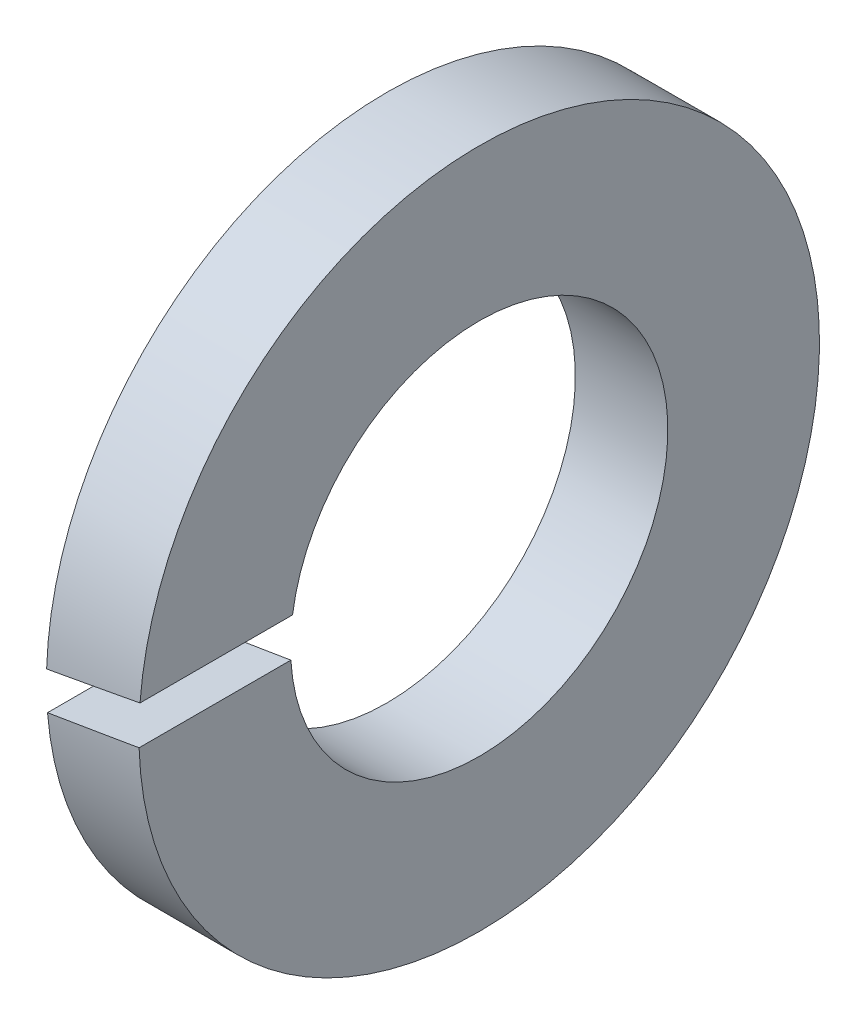
ISO-10303-21;
HEADER;
FILE_DESCRIPTION(('STEP AP214'),'2;1');
FILE_NAME('part.step','',(''),(''),'','','');
FILE_SCHEMA(('AUTOMOTIVE_DESIGN { 1 0 10303 214 1 1 1 1 }'));
ENDSEC;
DATA;
#1=APPLICATION_CONTEXT('core data for automotive mechanical design processes');
#2=APPLICATION_PROTOCOL_DEFINITION('international standard','automotive_design',2000,#1);
#3=PRODUCT_CONTEXT('',#1,'mechanical');
#4=PRODUCT('Part','Part','',(#3));
#5=PRODUCT_RELATED_PRODUCT_CATEGORY('part','',(#4));
#6=PRODUCT_DEFINITION_FORMATION('','',#4);
#7=PRODUCT_DEFINITION_CONTEXT('part definition',#1,'design');
#8=PRODUCT_DEFINITION('design','',#6,#7);
#9=PRODUCT_DEFINITION_SHAPE('','',#8);
#10=(LENGTH_UNIT() NAMED_UNIT(*) SI_UNIT(.MILLI.,.METRE.));
#11=(NAMED_UNIT(*) PLANE_ANGLE_UNIT() SI_UNIT($,.RADIAN.));
#12=(NAMED_UNIT(*) SI_UNIT($,.STERADIAN.) SOLID_ANGLE_UNIT());
#13=UNCERTAINTY_MEASURE_WITH_UNIT(LENGTH_MEASURE(1.E-05),#10,'distance_accuracy_value','');
#14=(GEOMETRIC_REPRESENTATION_CONTEXT(3) GLOBAL_UNCERTAINTY_ASSIGNED_CONTEXT((#13)) GLOBAL_UNIT_ASSIGNED_CONTEXT((#10,
#11,#12)) REPRESENTATION_CONTEXT('',''));
#15=CARTESIAN_POINT('',(0.,0.,0.));
#16=DIRECTION('',(0.,0.,1.));
#17=DIRECTION('',(1.,0.,0.));
#18=AXIS2_PLACEMENT_3D('',#15,#16,#17);
#19=CARTESIAN_POINT('',(-1.25,9.2,0.));
#20=DIRECTION('',(-1.,0.,0.));
#21=DIRECTION('',(0.,0.,1.));
#22=AXIS2_PLACEMENT_3D('',#19,#20,#21);
#23=PLANE('',#22);
#24=CARTESIAN_POINT('',(-1.25,0.,0.));
#25=DIRECTION('',(1.,0.,0.));
#26=DIRECTION('',(0.,0.,-1.));
#27=AXIS2_PLACEMENT_3D('',#24,#25,#26);
#28=CIRCLE('',#27,5.1);
#29=CARTESIAN_POINT('',(-1.25,-0.738276297947437,5.04628062119905));
#30=VERTEX_POINT('',#29);
#31=CARTESIAN_POINT('',(-1.25,0.297458846176199,5.09131792710213));
#32=VERTEX_POINT('',#31);
#33=EDGE_CURVE('E93',#30,#32,#28,.T.);
#34=ORIENTED_EDGE('',*,*,#33,.T.);
#35=DIRECTION('',(0.,0.,1.));
#36=VECTOR('',#35,1.);
#37=CARTESIAN_POINT('',(-1.25,0.297458846176199,0.));
#38=LINE('',#37,#36);
#39=CARTESIAN_POINT('',(-1.25,0.297458846176198,9.1951899509924));
#40=VERTEX_POINT('',#39);
#41=EDGE_CURVE('E74',#32,#40,#38,.T.);
#42=ORIENTED_EDGE('',*,*,#41,.T.);
#43=CARTESIAN_POINT('',(-1.25,0.,0.));
#44=DIRECTION('',(1.,0.,0.));
#45=DIRECTION('',(0.,0.,-1.));
#46=AXIS2_PLACEMENT_3D('',#43,#44,#45);
#47=CIRCLE('',#46,9.2);
#48=CARTESIAN_POINT('',(-1.25,-0.738276297947437,9.17032977094548));
#49=VERTEX_POINT('',#48);
#50=EDGE_CURVE('E79',#49,#40,#47,.T.);
#51=ORIENTED_EDGE('',*,*,#50,.F.);
#52=DIRECTION('',(0.,0.,-1.));
#53=VECTOR('',#52,1.);
#54=CARTESIAN_POINT('',(-1.25,-0.738276297947437,18.4));
#55=LINE('',#54,#53);
#56=EDGE_CURVE('E55',#49,#30,#55,.T.);
#57=ORIENTED_EDGE('',*,*,#56,.T.);
#58=EDGE_LOOP('',(#34,#42,#51,#57));
#59=FACE_BOUND('',#58,.T.);
#60=ADVANCED_FACE('F34',(#59),#23,.T.);
#61=CARTESIAN_POINT('',(1.25,0.,0.));
#62=DIRECTION('',(1.,0.,0.));
#63=DIRECTION('',(0.,0.,-1.));
#64=AXIS2_PLACEMENT_3D('',#61,#62,#63);
#65=CYLINDRICAL_SURFACE('',#64,5.1);
#66=CARTESIAN_POINT('',(1.25,0.,0.));
#67=DIRECTION('',(1.,0.,0.));
#68=DIRECTION('',(0.,0.,-1.));
#69=AXIS2_PLACEMENT_3D('',#66,#67,#68);
#70=CIRCLE('',#69,5.1);
#71=CARTESIAN_POINT('',(1.25,-0.297458846176197,5.09131792710213));
#72=VERTEX_POINT('',#71);
#73=CARTESIAN_POINT('',(1.25,0.738276297947439,5.04628062119905));
#74=VERTEX_POINT('',#73);
#75=EDGE_CURVE('E86',#72,#74,#70,.T.);
#76=ORIENTED_EDGE('',*,*,#75,.T.);
#77=CARTESIAN_POINT('',(-2.93697294640323,0.,0.));
#78=DIRECTION('',(0.17364817766696,-0.984807753012203,0.));
#79=DIRECTION('',(0.984807753012203,0.17364817766696,0.));
#80=AXIS2_PLACEMENT_3D('',#77,#78,#79);
#81=ELLIPSE('',#80,29.3697294640274,5.1);
#82=EDGE_CURVE('E71',#74,#32,#81,.T.);
#83=ORIENTED_EDGE('',*,*,#82,.T.);
#84=ORIENTED_EDGE('',*,*,#33,.F.);
#85=CARTESIAN_POINT('',(2.93697294640324,0.,0.));
#86=DIRECTION('',(-0.17364817766696,0.984807753012203,0.));
#87=DIRECTION('',(0.984807753012203,0.17364817766696,0.));
#88=AXIS2_PLACEMENT_3D('',#85,#86,#87);
#89=ELLIPSE('',#88,29.3697294640276,5.1);
#90=EDGE_CURVE('E92',#30,#72,#89,.T.);
#91=ORIENTED_EDGE('',*,*,#90,.T.);
#92=EDGE_LOOP('',(#76,#83,#84,#91));
#93=FACE_BOUND('',#92,.T.);
#94=ADVANCED_FACE('F91',(#93),#65,.F.);
#95=CARTESIAN_POINT('',(1.25,5.1,0.));
#96=DIRECTION('',(1.,0.,0.));
#97=DIRECTION('',(0.,0.,-1.));
#98=AXIS2_PLACEMENT_3D('',#95,#96,#97);
#99=PLANE('',#98);
#100=ORIENTED_EDGE('',*,*,#75,.F.);
#101=DIRECTION('',(0.,0.,1.));
#102=VECTOR('',#101,1.);
#103=CARTESIAN_POINT('',(1.25,-0.297458846176197,0.));
#104=LINE('',#103,#102);
#105=CARTESIAN_POINT('',(1.25,-0.297458846176198,9.1951899509924));
#106=VERTEX_POINT('',#105);
#107=EDGE_CURVE('E106',#72,#106,#104,.T.);
#108=ORIENTED_EDGE('',*,*,#107,.T.);
#109=CARTESIAN_POINT('',(1.25,0.,0.));
#110=DIRECTION('',(1.,0.,0.));
#111=DIRECTION('',(0.,0.,-1.));
#112=AXIS2_PLACEMENT_3D('',#109,#110,#111);
#113=CIRCLE('',#112,9.2);
#114=CARTESIAN_POINT('',(1.25,0.738276297947439,9.17032977094548));
#115=VERTEX_POINT('',#114);
#116=EDGE_CURVE('E88',#106,#115,#113,.T.);
#117=ORIENTED_EDGE('',*,*,#116,.T.);
#118=DIRECTION('',(0.,0.,-1.));
#119=VECTOR('',#118,1.);
#120=CARTESIAN_POINT('',(1.25,0.738276297947439,18.4));
#121=LINE('',#120,#119);
#122=EDGE_CURVE('E48',#115,#74,#121,.T.);
#123=ORIENTED_EDGE('',*,*,#122,.T.);
#124=EDGE_LOOP('',(#100,#108,#117,#123));
#125=FACE_BOUND('',#124,.T.);
#126=ADVANCED_FACE('F84',(#125),#99,.T.);
#127=CARTESIAN_POINT('',(1.25,0.,0.));
#128=DIRECTION('',(1.,0.,0.));
#129=DIRECTION('',(0.,0.,-1.));
#130=AXIS2_PLACEMENT_3D('',#127,#128,#129);
#131=CYLINDRICAL_SURFACE('',#130,9.2);
#132=ORIENTED_EDGE('',*,*,#50,.T.);
#133=CARTESIAN_POINT('',(-2.93697294640323,0.,0.));
#134=DIRECTION('',(0.17364817766696,-0.984807753012203,0.));
#135=DIRECTION('',(0.984807753012203,0.17364817766696,0.));
#136=AXIS2_PLACEMENT_3D('',#133,#134,#135);
#137=ELLIPSE('',#136,52.9806884449122,9.2);
#138=EDGE_CURVE('E11',#40,#115,#137,.F.);
#139=ORIENTED_EDGE('',*,*,#138,.T.);
#140=ORIENTED_EDGE('',*,*,#116,.F.);
#141=CARTESIAN_POINT('',(2.93697294640324,0.,0.));
#142=DIRECTION('',(-0.17364817766696,0.984807753012203,0.));
#143=DIRECTION('',(0.984807753012203,0.17364817766696,0.));
#144=AXIS2_PLACEMENT_3D('',#141,#142,#143);
#145=ELLIPSE('',#144,52.9806884449125,9.2);
#146=EDGE_CURVE('E41',#106,#49,#145,.F.);
#147=ORIENTED_EDGE('',*,*,#146,.T.);
#148=EDGE_LOOP('',(#132,#139,#140,#147));
#149=FACE_BOUND('',#148,.T.);
#150=ADVANCED_FACE('F101',(#149),#131,.T.);
#151=CARTESIAN_POINT('',(-1.25,-0.738276297947437,18.4));
#152=DIRECTION('',(-0.17364817766696,0.984807753012203,0.));
#153=DIRECTION('',(-0.984807753012203,-0.17364817766696,0.));
#154=AXIS2_PLACEMENT_3D('',#151,#152,#153);
#155=PLANE('',#154);
#156=ORIENTED_EDGE('',*,*,#56,.F.);
#157=ORIENTED_EDGE('',*,*,#146,.F.);
#158=ORIENTED_EDGE('',*,*,#107,.F.);
#159=ORIENTED_EDGE('',*,*,#90,.F.);
#160=EDGE_LOOP('',(#156,#157,#158,#159));
#161=FACE_BOUND('',#160,.T.);
#162=ADVANCED_FACE('F108',(#161),#155,.T.);
#163=CARTESIAN_POINT('',(1.25,0.738276297947439,18.4));
#164=DIRECTION('',(0.17364817766696,-0.984807753012203,0.));
#165=DIRECTION('',(0.984807753012203,0.17364817766696,0.));
#166=AXIS2_PLACEMENT_3D('',#163,#164,#165);
#167=PLANE('',#166);
#168=ORIENTED_EDGE('',*,*,#122,.F.);
#169=ORIENTED_EDGE('',*,*,#138,.F.);
#170=ORIENTED_EDGE('',*,*,#41,.F.);
#171=ORIENTED_EDGE('',*,*,#82,.F.);
#172=EDGE_LOOP('',(#168,#169,#170,#171));
#173=FACE_BOUND('',#172,.T.);
#174=ADVANCED_FACE('F72',(#173),#167,.T.);
#175=CLOSED_SHELL('',(#60,#94,#126,#150,#162,#174));
#176=MANIFOLD_SOLID_BREP('B2',#175);
#177=ADVANCED_BREP_SHAPE_REPRESENTATION('',(#18,#176),#14);
#178=SHAPE_DEFINITION_REPRESENTATION(#9,#177);
ENDSEC;
END-ISO-10303-21;
